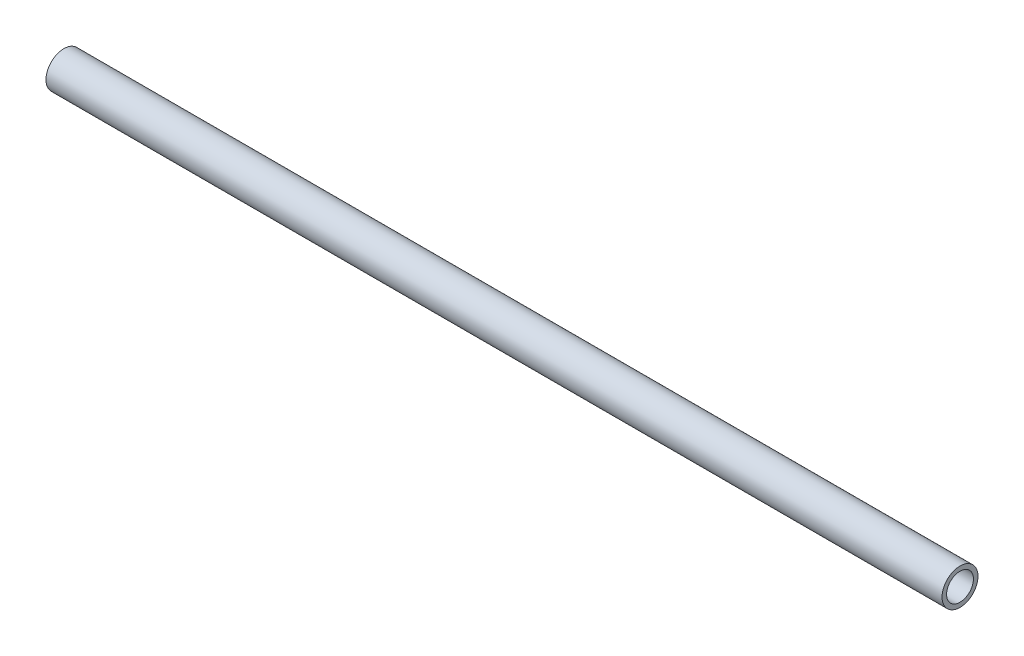
ISO-10303-21;
HEADER;
FILE_DESCRIPTION(('STEP AP214'),'2;1');
FILE_NAME('part.step','',(''),(''),'','','');
FILE_SCHEMA(('AUTOMOTIVE_DESIGN { 1 0 10303 214 1 1 1 1 }'));
ENDSEC;
DATA;
#1=APPLICATION_CONTEXT('core data for automotive mechanical design processes');
#2=APPLICATION_PROTOCOL_DEFINITION('international standard','automotive_design',2000,#1);
#3=PRODUCT_CONTEXT('',#1,'mechanical');
#4=PRODUCT('Part','Part','',(#3));
#5=PRODUCT_RELATED_PRODUCT_CATEGORY('part','',(#4));
#6=PRODUCT_DEFINITION_FORMATION('','',#4);
#7=PRODUCT_DEFINITION_CONTEXT('part definition',#1,'design');
#8=PRODUCT_DEFINITION('design','',#6,#7);
#9=PRODUCT_DEFINITION_SHAPE('','',#8);
#10=(LENGTH_UNIT() NAMED_UNIT(*) SI_UNIT(.MILLI.,.METRE.));
#11=(NAMED_UNIT(*) PLANE_ANGLE_UNIT() SI_UNIT($,.RADIAN.));
#12=(NAMED_UNIT(*) SI_UNIT($,.STERADIAN.) SOLID_ANGLE_UNIT());
#13=UNCERTAINTY_MEASURE_WITH_UNIT(LENGTH_MEASURE(1.E-05),#10,'distance_accuracy_value','');
#14=(GEOMETRIC_REPRESENTATION_CONTEXT(3) GLOBAL_UNCERTAINTY_ASSIGNED_CONTEXT((#13)) GLOBAL_UNIT_ASSIGNED_CONTEXT((#10,
#11,#12)) REPRESENTATION_CONTEXT('',''));
#15=CARTESIAN_POINT('',(0.,0.,0.));
#16=DIRECTION('',(0.,0.,1.));
#17=DIRECTION('',(1.,0.,0.));
#18=AXIS2_PLACEMENT_3D('',#15,#16,#17);
#19=CARTESIAN_POINT('',(0.,0.,0.));
#20=DIRECTION('',(1.,0.,0.));
#21=DIRECTION('',(0.,0.,-1.));
#22=AXIS2_PLACEMENT_3D('',#19,#20,#21);
#23=CYLINDRICAL_SURFACE('',#22,8.1153);
#24=CARTESIAN_POINT('',(541.3502,0.,0.));
#25=DIRECTION('',(1.,0.,0.));
#26=DIRECTION('',(0.,0.,-1.));
#27=AXIS2_PLACEMENT_3D('',#24,#25,#26);
#28=CIRCLE('',#27,8.1153);
#29=CARTESIAN_POINT('',(541.3502,0.,-8.1153));
#30=VERTEX_POINT('',#29);
#31=EDGE_CURVE('E17',#30,#30,#28,.F.);
#32=ORIENTED_EDGE('',*,*,#31,.F.);
#33=EDGE_LOOP('',(#32));
#34=FACE_BOUND('',#33,.T.);
#35=CARTESIAN_POINT('',(0.,0.,0.));
#36=DIRECTION('',(1.,0.,0.));
#37=DIRECTION('',(0.,0.,-1.));
#38=AXIS2_PLACEMENT_3D('',#35,#36,#37);
#39=CIRCLE('',#38,8.1153);
#40=CARTESIAN_POINT('',(0.,0.,-8.1153));
#41=VERTEX_POINT('',#40);
#42=EDGE_CURVE('E26',#41,#41,#39,.F.);
#43=ORIENTED_EDGE('',*,*,#42,.T.);
#44=EDGE_LOOP('',(#43));
#45=FACE_BOUND('',#44,.T.);
#46=ADVANCED_FACE('F14',(#34,#45),#23,.F.);
#47=CARTESIAN_POINT('',(541.3502,0.,0.));
#48=DIRECTION('',(1.,0.,0.));
#49=DIRECTION('',(0.,0.,-1.));
#50=AXIS2_PLACEMENT_3D('',#47,#48,#49);
#51=PLANE('',#50);
#52=ORIENTED_EDGE('',*,*,#31,.T.);
#53=EDGE_LOOP('',(#52));
#54=FACE_BOUND('',#53,.T.);
#55=CARTESIAN_POINT('',(541.3502,0.,0.));
#56=DIRECTION('',(1.,0.,0.));
#57=DIRECTION('',(0.,0.,-1.));
#58=AXIS2_PLACEMENT_3D('',#55,#56,#57);
#59=CIRCLE('',#58,10.8585);
#60=CARTESIAN_POINT('',(541.3502,0.,-10.8585));
#61=VERTEX_POINT('',#60);
#62=EDGE_CURVE('E21',#61,#61,#59,.F.);
#63=ORIENTED_EDGE('',*,*,#62,.F.);
#64=EDGE_LOOP('',(#63));
#65=FACE_BOUND('',#64,.T.);
#66=ADVANCED_FACE('F34',(#54,#65),#51,.T.);
#67=CARTESIAN_POINT('',(0.,0.,0.));
#68=DIRECTION('',(1.,0.,0.));
#69=DIRECTION('',(0.,0.,-1.));
#70=AXIS2_PLACEMENT_3D('',#67,#68,#69);
#71=PLANE('',#70);
#72=ORIENTED_EDGE('',*,*,#42,.F.);
#73=EDGE_LOOP('',(#72));
#74=FACE_BOUND('',#73,.T.);
#75=CARTESIAN_POINT('',(0.,0.,0.));
#76=DIRECTION('',(1.,0.,0.));
#77=DIRECTION('',(0.,0.,-1.));
#78=AXIS2_PLACEMENT_3D('',#75,#76,#77);
#79=CIRCLE('',#78,10.8585);
#80=CARTESIAN_POINT('',(0.,0.,-10.8585));
#81=VERTEX_POINT('',#80);
#82=EDGE_CURVE('E10',#81,#81,#79,.T.);
#83=ORIENTED_EDGE('',*,*,#82,.F.);
#84=EDGE_LOOP('',(#83));
#85=FACE_BOUND('',#84,.T.);
#86=ADVANCED_FACE('F42',(#74,#85),#71,.F.);
#87=CARTESIAN_POINT('',(0.,0.,0.));
#88=DIRECTION('',(1.,0.,0.));
#89=DIRECTION('',(0.,0.,-1.));
#90=AXIS2_PLACEMENT_3D('',#87,#88,#89);
#91=CYLINDRICAL_SURFACE('',#90,10.8585);
#92=ORIENTED_EDGE('',*,*,#62,.T.);
#93=EDGE_LOOP('',(#92));
#94=FACE_BOUND('',#93,.T.);
#95=ORIENTED_EDGE('',*,*,#82,.T.);
#96=EDGE_LOOP('',(#95));
#97=FACE_BOUND('',#96,.T.);
#98=ADVANCED_FACE('F43',(#94,#97),#91,.T.);
#99=CLOSED_SHELL('',(#46,#66,#86,#98));
#100=MANIFOLD_SOLID_BREP('B1',#99);
#101=ADVANCED_BREP_SHAPE_REPRESENTATION('',(#18,#100),#14);
#102=SHAPE_DEFINITION_REPRESENTATION(#9,#101);
ENDSEC;
END-ISO-10303-21;
